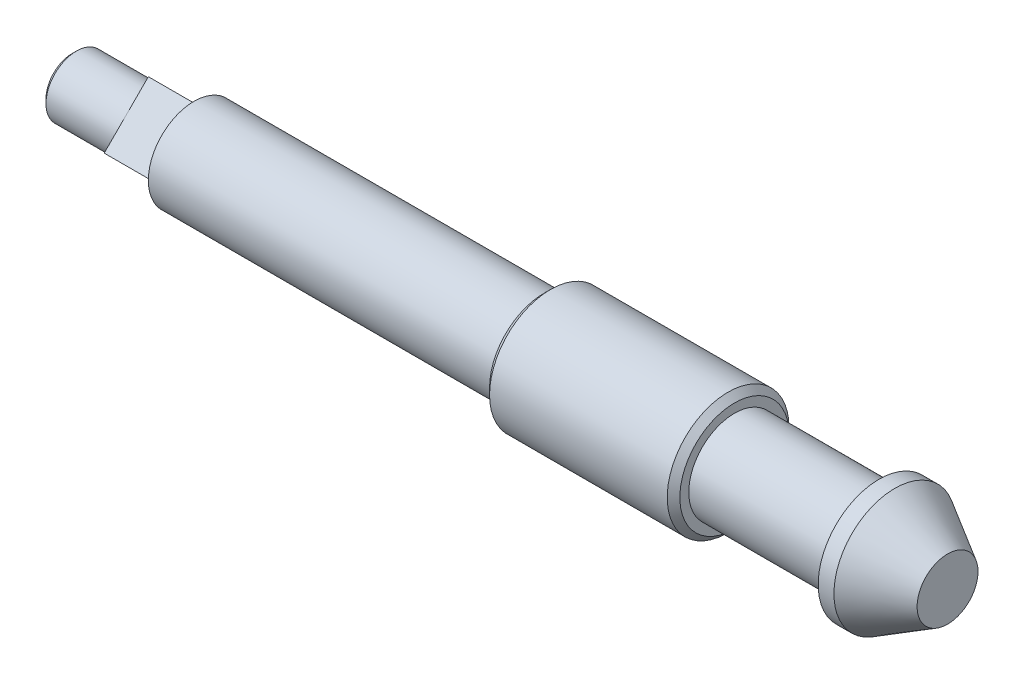
ISO-10303-21;
HEADER;
FILE_DESCRIPTION(('STEP AP214'),'2;1');
FILE_NAME('part.step','',(''),(''),'','','');
FILE_SCHEMA(('AUTOMOTIVE_DESIGN { 1 0 10303 214 1 1 1 1 }'));
ENDSEC;
DATA;
#1=APPLICATION_CONTEXT('core data for automotive mechanical design processes');
#2=APPLICATION_PROTOCOL_DEFINITION('international standard','automotive_design',2000,#1);
#3=PRODUCT_CONTEXT('',#1,'mechanical');
#4=PRODUCT('Part','Part','',(#3));
#5=PRODUCT_RELATED_PRODUCT_CATEGORY('part','',(#4));
#6=PRODUCT_DEFINITION_FORMATION('','',#4);
#7=PRODUCT_DEFINITION_CONTEXT('part definition',#1,'design');
#8=PRODUCT_DEFINITION('design','',#6,#7);
#9=PRODUCT_DEFINITION_SHAPE('','',#8);
#10=(LENGTH_UNIT() NAMED_UNIT(*) SI_UNIT(.MILLI.,.METRE.));
#11=(NAMED_UNIT(*) PLANE_ANGLE_UNIT() SI_UNIT($,.RADIAN.));
#12=(NAMED_UNIT(*) SI_UNIT($,.STERADIAN.) SOLID_ANGLE_UNIT());
#13=UNCERTAINTY_MEASURE_WITH_UNIT(LENGTH_MEASURE(1.E-05),#10,'distance_accuracy_value','');
#14=(GEOMETRIC_REPRESENTATION_CONTEXT(3) GLOBAL_UNCERTAINTY_ASSIGNED_CONTEXT((#13)) GLOBAL_UNIT_ASSIGNED_CONTEXT((#10,
#11,#12)) REPRESENTATION_CONTEXT('',''));
#15=CARTESIAN_POINT('',(0.,0.,0.));
#16=DIRECTION('',(0.,0.,1.));
#17=DIRECTION('',(1.,0.,0.));
#18=AXIS2_PLACEMENT_3D('',#15,#16,#17);
#19=CARTESIAN_POINT('',(0.,0.,0.));
#20=DIRECTION('',(1.,0.,0.));
#21=DIRECTION('',(0.,0.,-1.));
#22=AXIS2_PLACEMENT_3D('',#19,#20,#21);
#23=CYLINDRICAL_SURFACE('',#22,5.99999999999999);
#24=CARTESIAN_POINT('',(-53.,0.,0.));
#25=DIRECTION('',(1.,0.,0.));
#26=DIRECTION('',(0.,0.,-1.));
#27=AXIS2_PLACEMENT_3D('',#24,#25,#26);
#28=CIRCLE('',#27,5.99999999999999);
#29=CARTESIAN_POINT('',(-53.,0.,-5.99999999999999));
#30=VERTEX_POINT('',#29);
#31=EDGE_CURVE('E132',#30,#30,#28,.T.);
#32=ORIENTED_EDGE('',*,*,#31,.F.);
#33=EDGE_LOOP('',(#32));
#34=FACE_BOUND('',#33,.T.);
#35=CARTESIAN_POINT('',(-99.,0.,0.));
#36=DIRECTION('',(-1.,0.,0.));
#37=DIRECTION('',(0.,0.,1.));
#38=AXIS2_PLACEMENT_3D('',#35,#36,#37);
#39=CIRCLE('',#38,5.99999999999998);
#40=CARTESIAN_POINT('',(-99.,0.,5.99999999999998));
#41=VERTEX_POINT('',#40);
#42=EDGE_CURVE('E123',#41,#41,#39,.T.);
#43=ORIENTED_EDGE('',*,*,#42,.F.);
#44=EDGE_LOOP('',(#43));
#45=FACE_BOUND('',#44,.T.);
#46=ADVANCED_FACE('F48',(#34,#45),#23,.T.);
#47=CARTESIAN_POINT('',(0.,0.,0.));
#48=DIRECTION('',(1.,0.,0.));
#49=DIRECTION('',(0.,0.,-1.));
#50=AXIS2_PLACEMENT_3D('',#47,#48,#49);
#51=PLANE('',#50);
#52=CARTESIAN_POINT('',(0.,0.,0.));
#53=DIRECTION('',(1.,0.,0.));
#54=DIRECTION('',(0.,0.,-1.));
#55=AXIS2_PLACEMENT_3D('',#52,#53,#54);
#56=CIRCLE('',#55,4.);
#57=CARTESIAN_POINT('',(0.,0.,-4.));
#58=VERTEX_POINT('',#57);
#59=EDGE_CURVE('E147',#58,#58,#56,.T.);
#60=ORIENTED_EDGE('',*,*,#59,.T.);
#61=EDGE_LOOP('',(#60));
#62=FACE_BOUND('',#61,.T.);
#63=ADVANCED_FACE('F177',(#62),#51,.T.);
#64=CARTESIAN_POINT('',(0.,0.,0.));
#65=DIRECTION('',(-1.,0.,0.));
#66=DIRECTION('',(0.,0.,1.));
#67=AXIS2_PLACEMENT_3D('',#64,#65,#66);
#68=CONICAL_SURFACE('',#67,4.,0.523598775598296);
#69=CARTESIAN_POINT('',(-6.92820323027555,0.,0.));
#70=DIRECTION('',(1.,0.,0.));
#71=DIRECTION('',(0.,0.,-1.));
#72=AXIS2_PLACEMENT_3D('',#69,#70,#71);
#73=CIRCLE('',#72,8.);
#74=CARTESIAN_POINT('',(-6.92820323027555,0.,-8.));
#75=VERTEX_POINT('',#74);
#76=EDGE_CURVE('E144',#75,#75,#73,.T.);
#77=ORIENTED_EDGE('',*,*,#76,.T.);
#78=EDGE_LOOP('',(#77));
#79=FACE_BOUND('',#78,.T.);
#80=ORIENTED_EDGE('',*,*,#59,.F.);
#81=EDGE_LOOP('',(#80));
#82=FACE_BOUND('',#81,.T.);
#83=ADVANCED_FACE('F183',(#79,#82),#68,.T.);
#84=CARTESIAN_POINT('',(0.,0.,0.));
#85=DIRECTION('',(1.,0.,0.));
#86=DIRECTION('',(0.,0.,-1.));
#87=AXIS2_PLACEMENT_3D('',#84,#85,#86);
#88=CYLINDRICAL_SURFACE('',#87,8.);
#89=CARTESIAN_POINT('',(-9.,0.,0.));
#90=DIRECTION('',(1.,0.,0.));
#91=DIRECTION('',(0.,0.,-1.));
#92=AXIS2_PLACEMENT_3D('',#89,#90,#91);
#93=CIRCLE('',#92,8.);
#94=CARTESIAN_POINT('',(-9.,0.,-8.));
#95=VERTEX_POINT('',#94);
#96=EDGE_CURVE('E141',#95,#95,#93,.T.);
#97=ORIENTED_EDGE('',*,*,#96,.T.);
#98=EDGE_LOOP('',(#97));
#99=FACE_BOUND('',#98,.T.);
#100=ORIENTED_EDGE('',*,*,#76,.F.);
#101=EDGE_LOOP('',(#100));
#102=FACE_BOUND('',#101,.T.);
#103=ADVANCED_FACE('F210',(#99,#102),#88,.T.);
#104=CARTESIAN_POINT('',(-9.,8.00000000000018,-1.94289029309402E-13));
#105=DIRECTION('',(-1.,0.,0.));
#106=DIRECTION('',(0.,0.,1.));
#107=AXIS2_PLACEMENT_3D('',#104,#105,#106);
#108=PLANE('',#107);
#109=CARTESIAN_POINT('',(-9.,0.,0.));
#110=DIRECTION('',(1.,0.,0.));
#111=DIRECTION('',(0.,0.,-1.));
#112=AXIS2_PLACEMENT_3D('',#109,#110,#111);
#113=CIRCLE('',#112,6.);
#114=CARTESIAN_POINT('',(-9.,0.,-6.));
#115=VERTEX_POINT('',#114);
#116=EDGE_CURVE('E138',#115,#115,#113,.T.);
#117=ORIENTED_EDGE('',*,*,#116,.T.);
#118=EDGE_LOOP('',(#117));
#119=FACE_BOUND('',#118,.T.);
#120=ORIENTED_EDGE('',*,*,#96,.F.);
#121=EDGE_LOOP('',(#120));
#122=FACE_BOUND('',#121,.T.);
#123=ADVANCED_FACE('F206',(#119,#122),#108,.T.);
#124=CARTESIAN_POINT('',(0.,0.,0.));
#125=DIRECTION('',(1.,0.,0.));
#126=DIRECTION('',(0.,0.,-1.));
#127=AXIS2_PLACEMENT_3D('',#124,#125,#126);
#128=CYLINDRICAL_SURFACE('',#127,6.);
#129=CARTESIAN_POINT('',(-28.,0.,0.));
#130=DIRECTION('',(1.,0.,0.));
#131=DIRECTION('',(0.,0.,-1.));
#132=AXIS2_PLACEMENT_3D('',#129,#130,#131);
#133=CIRCLE('',#132,6.);
#134=CARTESIAN_POINT('',(-28.,0.,-6.));
#135=VERTEX_POINT('',#134);
#136=EDGE_CURVE('E135',#135,#135,#133,.T.);
#137=ORIENTED_EDGE('',*,*,#136,.T.);
#138=EDGE_LOOP('',(#137));
#139=FACE_BOUND('',#138,.T.);
#140=ORIENTED_EDGE('',*,*,#116,.F.);
#141=EDGE_LOOP('',(#140));
#142=FACE_BOUND('',#141,.T.);
#143=ADVANCED_FACE('F202',(#139,#142),#128,.T.);
#144=CARTESIAN_POINT('',(-28.,5.99999999999999,0.));
#145=DIRECTION('',(1.,0.,0.));
#146=DIRECTION('',(0.,0.,-1.));
#147=AXIS2_PLACEMENT_3D('',#144,#145,#146);
#148=PLANE('',#147);
#149=CARTESIAN_POINT('',(-28.,0.,0.));
#150=DIRECTION('',(1.,0.,0.));
#151=DIRECTION('',(0.,0.,-1.));
#152=AXIS2_PLACEMENT_3D('',#149,#150,#151);
#153=CIRCLE('',#152,7.172);
#154=CARTESIAN_POINT('',(-28.,0.,-7.172));
#155=VERTEX_POINT('',#154);
#156=EDGE_CURVE('E159',#155,#155,#153,.T.);
#157=ORIENTED_EDGE('',*,*,#156,.T.);
#158=EDGE_LOOP('',(#157));
#159=FACE_BOUND('',#158,.T.);
#160=ORIENTED_EDGE('',*,*,#136,.F.);
#161=EDGE_LOOP('',(#160));
#162=FACE_BOUND('',#161,.T.);
#163=ADVANCED_FACE('F198',(#159,#162),#148,.T.);
#164=CARTESIAN_POINT('',(0.,0.,0.));
#165=DIRECTION('',(1.,0.,0.));
#166=DIRECTION('',(0.,0.,-1.));
#167=AXIS2_PLACEMENT_3D('',#164,#165,#166);
#168=CYLINDRICAL_SURFACE('',#167,8.);
#169=CARTESIAN_POINT('',(-52.172,0.,0.));
#170=DIRECTION('',(-1.,0.,0.));
#171=DIRECTION('',(0.,0.,1.));
#172=AXIS2_PLACEMENT_3D('',#169,#170,#171);
#173=CIRCLE('',#172,8.);
#174=CARTESIAN_POINT('',(-52.172,0.,8.));
#175=VERTEX_POINT('',#174);
#176=EDGE_CURVE('E153',#175,#175,#173,.F.);
#177=ORIENTED_EDGE('',*,*,#176,.T.);
#178=EDGE_LOOP('',(#177));
#179=FACE_BOUND('',#178,.T.);
#180=CARTESIAN_POINT('',(-28.828,0.,0.));
#181=DIRECTION('',(1.,0.,0.));
#182=DIRECTION('',(0.,0.,-1.));
#183=AXIS2_PLACEMENT_3D('',#180,#181,#182);
#184=CIRCLE('',#183,8.);
#185=CARTESIAN_POINT('',(-28.828,0.,-8.));
#186=VERTEX_POINT('',#185);
#187=EDGE_CURVE('E150',#186,#186,#184,.F.);
#188=ORIENTED_EDGE('',*,*,#187,.T.);
#189=EDGE_LOOP('',(#188));
#190=FACE_BOUND('',#189,.T.);
#191=ADVANCED_FACE('F194',(#179,#190),#168,.T.);
#192=CARTESIAN_POINT('',(-53.,8.00000000000019,-2.0122792321331E-13));
#193=DIRECTION('',(-1.,0.,0.));
#194=DIRECTION('',(0.,0.,1.));
#195=AXIS2_PLACEMENT_3D('',#192,#193,#194);
#196=PLANE('',#195);
#197=CARTESIAN_POINT('',(-53.,0.,0.));
#198=DIRECTION('',(-1.,0.,0.));
#199=DIRECTION('',(0.,0.,1.));
#200=AXIS2_PLACEMENT_3D('',#197,#198,#199);
#201=CIRCLE('',#200,7.17199999999998);
#202=CARTESIAN_POINT('',(-53.,0.,7.17199999999998));
#203=VERTEX_POINT('',#202);
#204=EDGE_CURVE('E156',#203,#203,#201,.T.);
#205=ORIENTED_EDGE('',*,*,#204,.T.);
#206=EDGE_LOOP('',(#205));
#207=FACE_BOUND('',#206,.T.);
#208=ORIENTED_EDGE('',*,*,#31,.T.);
#209=EDGE_LOOP('',(#208));
#210=FACE_BOUND('',#209,.T.);
#211=ADVANCED_FACE('F190',(#207,#210),#196,.T.);
#212=CARTESIAN_POINT('',(-52.172,0.,0.));
#213=DIRECTION('',(1.,0.,0.));
#214=DIRECTION('',(0.,0.,-1.));
#215=AXIS2_PLACEMENT_3D('',#212,#213,#214);
#216=CONICAL_SURFACE('',#215,8.,0.78539816339745);
#217=ORIENTED_EDGE('',*,*,#204,.F.);
#218=EDGE_LOOP('',(#217));
#219=FACE_BOUND('',#218,.T.);
#220=ORIENTED_EDGE('',*,*,#176,.F.);
#221=EDGE_LOOP('',(#220));
#222=FACE_BOUND('',#221,.T.);
#223=ADVANCED_FACE('F193',(#219,#222),#216,.T.);
#224=CARTESIAN_POINT('',(-28.,0.,0.));
#225=DIRECTION('',(-1.,0.,0.));
#226=DIRECTION('',(0.,0.,1.));
#227=AXIS2_PLACEMENT_3D('',#224,#225,#226);
#228=CONICAL_SURFACE('',#227,7.172,0.78539816339745);
#229=ORIENTED_EDGE('',*,*,#187,.F.);
#230=EDGE_LOOP('',(#229));
#231=FACE_BOUND('',#230,.T.);
#232=ORIENTED_EDGE('',*,*,#156,.F.);
#233=EDGE_LOOP('',(#232));
#234=FACE_BOUND('',#233,.T.);
#235=ADVANCED_FACE('F219',(#231,#234),#228,.T.);
#236=CARTESIAN_POINT('',(-99.,0.,0.));
#237=DIRECTION('',(-1.,0.,0.));
#238=DIRECTION('',(0.,0.,1.));
#239=AXIS2_PLACEMENT_3D('',#236,#237,#238);
#240=PLANE('',#239);
#241=DIRECTION('',(0.,0.707106781186547,0.707106781186548));
#242=VECTOR('',#241,1.);
#243=CARTESIAN_POINT('',(-99.,-5.7982756057296,-1.00613961606655E-13));
#244=LINE('',#243,#242);
#245=CARTESIAN_POINT('',(-99.,-5.7982756057296,-1.00613961606655E-13));
#246=VERTEX_POINT('',#245);
#247=CARTESIAN_POINT('',(-99.,0.,5.79827560572969));
#248=VERTEX_POINT('',#247);
#249=EDGE_CURVE('E101',#246,#248,#244,.T.);
#250=ORIENTED_EDGE('',*,*,#249,.F.);
#251=DIRECTION('',(0.,-0.707106781186548,0.707106781186547));
#252=VECTOR('',#251,1.);
#253=CARTESIAN_POINT('',(-99.,0.,-5.79827560572969));
#254=LINE('',#253,#252);
#255=CARTESIAN_POINT('',(-99.,0.,-5.79827560572969));
#256=VERTEX_POINT('',#255);
#257=EDGE_CURVE('E71',#256,#246,#254,.T.);
#258=ORIENTED_EDGE('',*,*,#257,.F.);
#259=DIRECTION('',(0.,-0.707106781186548,-0.707106781186548));
#260=VECTOR('',#259,1.);
#261=CARTESIAN_POINT('',(-99.,5.79827560572969,0.));
#262=LINE('',#261,#260);
#263=CARTESIAN_POINT('',(-99.,5.79827560572969,0.));
#264=VERTEX_POINT('',#263);
#265=EDGE_CURVE('E93',#264,#256,#262,.T.);
#266=ORIENTED_EDGE('',*,*,#265,.F.);
#267=DIRECTION('',(0.,0.707106781186548,-0.707106781186547));
#268=VECTOR('',#267,1.);
#269=CARTESIAN_POINT('',(-99.,0.,5.79827560572969));
#270=LINE('',#269,#268);
#271=EDGE_CURVE('E106',#248,#264,#270,.T.);
#272=ORIENTED_EDGE('',*,*,#271,.F.);
#273=EDGE_LOOP('',(#250,#258,#266,#272));
#274=FACE_BOUND('',#273,.T.);
#275=ORIENTED_EDGE('',*,*,#42,.T.);
#276=EDGE_LOOP('',(#275));
#277=FACE_BOUND('',#276,.T.);
#278=ADVANCED_FACE('F104',(#274,#277),#240,.T.);
#279=CARTESIAN_POINT('',(-99.,0.,5.79827560572969));
#280=DIRECTION('',(0.,0.707106781186547,0.707106781186548));
#281=DIRECTION('',(0.,-0.707106781186548,0.707106781186547));
#282=AXIS2_PLACEMENT_3D('',#279,#280,#281);
#283=PLANE('',#282);
#284=DIRECTION('',(0.,0.707106781186548,-0.707106781186547));
#285=VECTOR('',#284,1.);
#286=CARTESIAN_POINT('',(-105.,0.,5.79827560572969));
#287=LINE('',#286,#285);
#288=CARTESIAN_POINT('',(-105.,0.,5.79827560572969));
#289=VERTEX_POINT('',#288);
#290=CARTESIAN_POINT('',(-105.,5.79827560572969,0.));
#291=VERTEX_POINT('',#290);
#292=EDGE_CURVE('E118',#289,#291,#287,.T.);
#293=ORIENTED_EDGE('',*,*,#292,.F.);
#294=DIRECTION('',(-1.,0.,0.));
#295=VECTOR('',#294,1.);
#296=CARTESIAN_POINT('',(-99.,0.,5.79827560572969));
#297=LINE('',#296,#295);
#298=EDGE_CURVE('E110',#248,#289,#297,.T.);
#299=ORIENTED_EDGE('',*,*,#298,.F.);
#300=ORIENTED_EDGE('',*,*,#271,.T.);
#301=DIRECTION('',(-1.,0.,0.));
#302=VECTOR('',#301,1.);
#303=CARTESIAN_POINT('',(-99.,5.79827560572969,0.));
#304=LINE('',#303,#302);
#305=EDGE_CURVE('E91',#264,#291,#304,.T.);
#306=ORIENTED_EDGE('',*,*,#305,.T.);
#307=EDGE_LOOP('',(#293,#299,#300,#306));
#308=FACE_BOUND('',#307,.T.);
#309=ADVANCED_FACE('F109',(#308),#283,.T.);
#310=CARTESIAN_POINT('',(-99.,-5.7982756057296,-1.00613961606655E-13));
#311=DIRECTION('',(0.,-0.707106781186548,0.707106781186547));
#312=DIRECTION('',(0.,-0.707106781186547,-0.707106781186548));
#313=AXIS2_PLACEMENT_3D('',#310,#311,#312);
#314=PLANE('',#313);
#315=DIRECTION('',(0.,0.707106781186547,0.707106781186548));
#316=VECTOR('',#315,1.);
#317=CARTESIAN_POINT('',(-105.,-5.7982756057296,-1.00613961606655E-13));
#318=LINE('',#317,#316);
#319=CARTESIAN_POINT('',(-105.,-5.7982756057296,-1.00613961606655E-13));
#320=VERTEX_POINT('',#319);
#321=EDGE_CURVE('E111',#320,#289,#318,.T.);
#322=ORIENTED_EDGE('',*,*,#321,.F.);
#323=DIRECTION('',(-1.,0.,0.));
#324=VECTOR('',#323,1.);
#325=CARTESIAN_POINT('',(-99.,-5.7982756057296,-1.00613961606655E-13));
#326=LINE('',#325,#324);
#327=EDGE_CURVE('E124',#246,#320,#326,.T.);
#328=ORIENTED_EDGE('',*,*,#327,.F.);
#329=ORIENTED_EDGE('',*,*,#249,.T.);
#330=ORIENTED_EDGE('',*,*,#298,.T.);
#331=EDGE_LOOP('',(#322,#328,#329,#330));
#332=FACE_BOUND('',#331,.T.);
#333=ADVANCED_FACE('F244',(#332),#314,.T.);
#334=CARTESIAN_POINT('',(-99.,0.,-5.79827560572969));
#335=DIRECTION('',(0.,-0.707106781186547,-0.707106781186548));
#336=DIRECTION('',(0.,0.707106781186548,-0.707106781186547));
#337=AXIS2_PLACEMENT_3D('',#334,#335,#336);
#338=PLANE('',#337);
#339=DIRECTION('',(0.,-0.707106781186548,0.707106781186547));
#340=VECTOR('',#339,1.);
#341=CARTESIAN_POINT('',(-105.,0.,-5.79827560572969));
#342=LINE('',#341,#340);
#343=CARTESIAN_POINT('',(-105.,0.,-5.79827560572969));
#344=VERTEX_POINT('',#343);
#345=EDGE_CURVE('E63',#344,#320,#342,.T.);
#346=ORIENTED_EDGE('',*,*,#345,.F.);
#347=DIRECTION('',(-1.,0.,0.));
#348=VECTOR('',#347,1.);
#349=CARTESIAN_POINT('',(-99.,0.,-5.79827560572969));
#350=LINE('',#349,#348);
#351=EDGE_CURVE('E100',#256,#344,#350,.T.);
#352=ORIENTED_EDGE('',*,*,#351,.F.);
#353=ORIENTED_EDGE('',*,*,#257,.T.);
#354=ORIENTED_EDGE('',*,*,#327,.T.);
#355=EDGE_LOOP('',(#346,#352,#353,#354));
#356=FACE_BOUND('',#355,.T.);
#357=ADVANCED_FACE('F258',(#356),#338,.T.);
#358=CARTESIAN_POINT('',(-99.,5.79827560572969,0.));
#359=DIRECTION('',(0.,0.707106781186547,-0.707106781186548));
#360=DIRECTION('',(0.,0.707106781186548,0.707106781186547));
#361=AXIS2_PLACEMENT_3D('',#358,#359,#360);
#362=PLANE('',#361);
#363=DIRECTION('',(0.,-0.707106781186548,-0.707106781186548));
#364=VECTOR('',#363,1.);
#365=CARTESIAN_POINT('',(-105.,5.79827560572969,0.));
#366=LINE('',#365,#364);
#367=EDGE_CURVE('E95',#291,#344,#366,.T.);
#368=ORIENTED_EDGE('',*,*,#367,.F.);
#369=ORIENTED_EDGE('',*,*,#305,.F.);
#370=ORIENTED_EDGE('',*,*,#265,.T.);
#371=ORIENTED_EDGE('',*,*,#351,.T.);
#372=EDGE_LOOP('',(#368,#369,#370,#371));
#373=FACE_BOUND('',#372,.T.);
#374=ADVANCED_FACE('F92',(#373),#362,.T.);
#375=CARTESIAN_POINT('',(-115.,5.99999999999999,0.));
#376=DIRECTION('',(-1.,0.,0.));
#377=DIRECTION('',(0.,0.,1.));
#378=AXIS2_PLACEMENT_3D('',#375,#376,#377);
#379=PLANE('',#378);
#380=CARTESIAN_POINT('',(-115.,0.,0.));
#381=DIRECTION('',(-1.,0.,0.));
#382=DIRECTION('',(0.,0.,1.));
#383=AXIS2_PLACEMENT_3D('',#380,#381,#382);
#384=CIRCLE('',#383,3.4455);
#385=CARTESIAN_POINT('',(-115.,0.,3.4455));
#386=VERTEX_POINT('',#385);
#387=EDGE_CURVE('E56',#386,#386,#384,.T.);
#388=ORIENTED_EDGE('',*,*,#387,.T.);
#389=EDGE_LOOP('',(#388));
#390=FACE_BOUND('',#389,.T.);
#391=ADVANCED_FACE('F164',(#390),#379,.T.);
#392=CARTESIAN_POINT('',(-105.,0.,0.));
#393=DIRECTION('',(-1.,0.,0.));
#394=DIRECTION('',(0.,0.,1.));
#395=AXIS2_PLACEMENT_3D('',#392,#393,#394);
#396=CYLINDRICAL_SURFACE('',#395,4.);
#397=CARTESIAN_POINT('',(-114.4455,0.,0.));
#398=DIRECTION('',(-1.,0.,0.));
#399=DIRECTION('',(0.,0.,1.));
#400=AXIS2_PLACEMENT_3D('',#397,#398,#399);
#401=CIRCLE('',#400,4.);
#402=CARTESIAN_POINT('',(-114.4455,0.,4.));
#403=VERTEX_POINT('',#402);
#404=EDGE_CURVE('E13',#403,#403,#401,.F.);
#405=ORIENTED_EDGE('',*,*,#404,.T.);
#406=EDGE_LOOP('',(#405));
#407=FACE_BOUND('',#406,.T.);
#408=CARTESIAN_POINT('',(-105.,0.,0.));
#409=DIRECTION('',(-1.,0.,0.));
#410=DIRECTION('',(0.,0.,1.));
#411=AXIS2_PLACEMENT_3D('',#408,#409,#410);
#412=CIRCLE('',#411,4.);
#413=CARTESIAN_POINT('',(-105.,0.,4.));
#414=VERTEX_POINT('',#413);
#415=EDGE_CURVE('E129',#414,#414,#412,.T.);
#416=ORIENTED_EDGE('',*,*,#415,.T.);
#417=EDGE_LOOP('',(#416));
#418=FACE_BOUND('',#417,.T.);
#419=ADVANCED_FACE('F172',(#407,#418),#396,.T.);
#420=CARTESIAN_POINT('',(-105.,0.,0.));
#421=DIRECTION('',(-1.,0.,0.));
#422=DIRECTION('',(0.,0.,1.));
#423=AXIS2_PLACEMENT_3D('',#420,#421,#422);
#424=PLANE('',#423);
#425=ORIENTED_EDGE('',*,*,#415,.F.);
#426=EDGE_LOOP('',(#425));
#427=FACE_BOUND('',#426,.T.);
#428=ORIENTED_EDGE('',*,*,#321,.T.);
#429=ORIENTED_EDGE('',*,*,#292,.T.);
#430=ORIENTED_EDGE('',*,*,#367,.T.);
#431=ORIENTED_EDGE('',*,*,#345,.T.);
#432=EDGE_LOOP('',(#428,#429,#430,#431));
#433=FACE_BOUND('',#432,.T.);
#434=ADVANCED_FACE('F167',(#427,#433),#424,.T.);
#435=CARTESIAN_POINT('',(-115.,0.,0.));
#436=DIRECTION('',(1.,0.,0.));
#437=DIRECTION('',(0.,0.,-1.));
#438=AXIS2_PLACEMENT_3D('',#435,#436,#437);
#439=CONICAL_SURFACE('',#438,3.4455,0.785398163397445);
#440=ORIENTED_EDGE('',*,*,#404,.F.);
#441=EDGE_LOOP('',(#440));
#442=FACE_BOUND('',#441,.T.);
#443=ORIENTED_EDGE('',*,*,#387,.F.);
#444=EDGE_LOOP('',(#443));
#445=FACE_BOUND('',#444,.T.);
#446=ADVANCED_FACE('F50',(#442,#445),#439,.T.);
#447=CLOSED_SHELL('',(#46,#63,#83,#103,#123,#143,#163,#191,#211,#223,#235,#278,#309,#333,#357,
#374,#391,#419,#434,#446));
#448=MANIFOLD_SOLID_BREP('B2',#447);
#449=ADVANCED_BREP_SHAPE_REPRESENTATION('',(#18,#448),#14);
#450=SHAPE_DEFINITION_REPRESENTATION(#9,#449);
ENDSEC;
END-ISO-10303-21;
